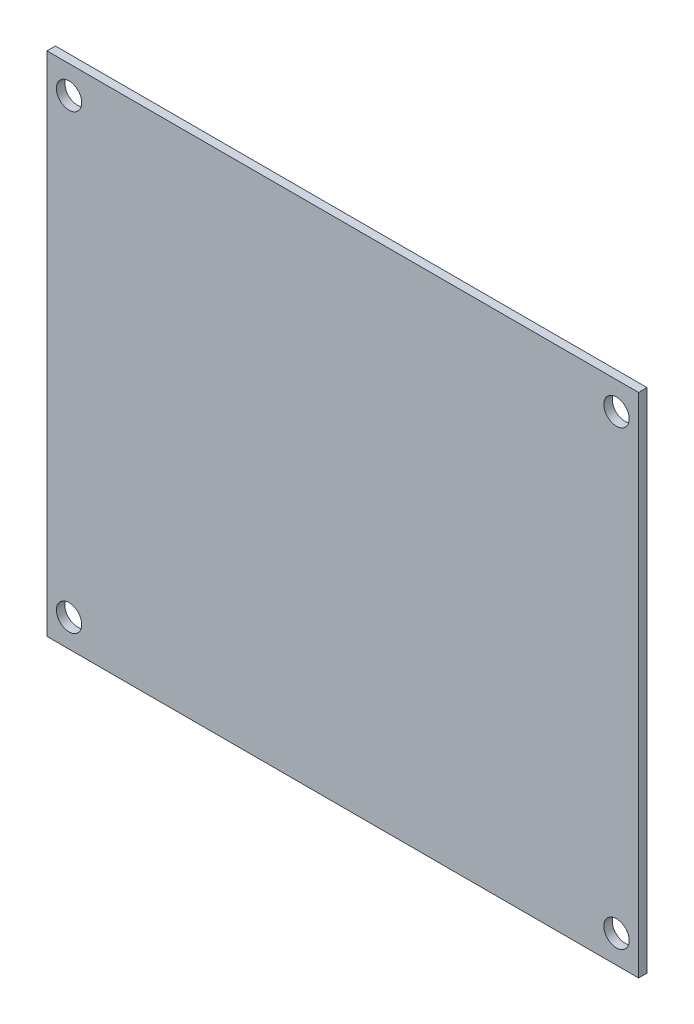
ISO-10303-21;
HEADER;
FILE_DESCRIPTION(('STEP AP214'),'2;1');
FILE_NAME('part.step','',(''),(''),'','','');
FILE_SCHEMA(('AUTOMOTIVE_DESIGN { 1 0 10303 214 1 1 1 1 }'));
ENDSEC;
DATA;
#1=APPLICATION_CONTEXT('core data for automotive mechanical design processes');
#2=APPLICATION_PROTOCOL_DEFINITION('international standard','automotive_design',2000,#1);
#3=PRODUCT_CONTEXT('',#1,'mechanical');
#4=PRODUCT('Part','Part','',(#3));
#5=PRODUCT_RELATED_PRODUCT_CATEGORY('part','',(#4));
#6=PRODUCT_DEFINITION_FORMATION('','',#4);
#7=PRODUCT_DEFINITION_CONTEXT('part definition',#1,'design');
#8=PRODUCT_DEFINITION('design','',#6,#7);
#9=PRODUCT_DEFINITION_SHAPE('','',#8);
#10=(LENGTH_UNIT() NAMED_UNIT(*) SI_UNIT(.MILLI.,.METRE.));
#11=(NAMED_UNIT(*) PLANE_ANGLE_UNIT() SI_UNIT($,.RADIAN.));
#12=(NAMED_UNIT(*) SI_UNIT($,.STERADIAN.) SOLID_ANGLE_UNIT());
#13=UNCERTAINTY_MEASURE_WITH_UNIT(LENGTH_MEASURE(1.E-05),#10,'distance_accuracy_value','');
#14=(GEOMETRIC_REPRESENTATION_CONTEXT(3) GLOBAL_UNCERTAINTY_ASSIGNED_CONTEXT((#13)) GLOBAL_UNIT_ASSIGNED_CONTEXT((#10,
#11,#12)) REPRESENTATION_CONTEXT('',''));
#15=CARTESIAN_POINT('',(0.,0.,0.));
#16=DIRECTION('',(0.,0.,1.));
#17=DIRECTION('',(1.,0.,0.));
#18=AXIS2_PLACEMENT_3D('',#15,#16,#17);
#19=CARTESIAN_POINT('',(0.,0.,1.));
#20=DIRECTION('',(0.,0.,1.));
#21=DIRECTION('',(1.,0.,0.));
#22=AXIS2_PLACEMENT_3D('',#19,#20,#21);
#23=PLANE('',#22);
#24=CARTESIAN_POINT('',(32.385,-26.73,1.));
#25=DIRECTION('',(0.,0.,1.));
#26=DIRECTION('',(1.,0.,0.));
#27=AXIS2_PLACEMENT_3D('',#24,#25,#26);
#28=CIRCLE('',#27,1.5);
#29=CARTESIAN_POINT('',(33.885,-26.73,1.));
#30=VERTEX_POINT('',#29);
#31=EDGE_CURVE('E121',#30,#30,#28,.T.);
#32=ORIENTED_EDGE('',*,*,#31,.F.);
#33=EDGE_LOOP('',(#32));
#34=FACE_BOUND('',#33,.T.);
#35=CARTESIAN_POINT('',(-32.385,26.73,1.));
#36=DIRECTION('',(0.,0.,1.));
#37=DIRECTION('',(1.,0.,0.));
#38=AXIS2_PLACEMENT_3D('',#35,#36,#37);
#39=CIRCLE('',#38,1.5);
#40=CARTESIAN_POINT('',(-30.885,26.73,1.));
#41=VERTEX_POINT('',#40);
#42=EDGE_CURVE('E100',#41,#41,#39,.T.);
#43=ORIENTED_EDGE('',*,*,#42,.F.);
#44=EDGE_LOOP('',(#43));
#45=FACE_BOUND('',#44,.T.);
#46=DIRECTION('',(0.,1.,0.));
#47=VECTOR('',#46,1.);
#48=CARTESIAN_POINT('',(35.,30.,1.));
#49=LINE('',#48,#47);
#50=CARTESIAN_POINT('',(35.,-30.,1.));
#51=VERTEX_POINT('',#50);
#52=CARTESIAN_POINT('',(35.,30.,1.));
#53=VERTEX_POINT('',#52);
#54=EDGE_CURVE('E85',#51,#53,#49,.T.);
#55=ORIENTED_EDGE('',*,*,#54,.T.);
#56=DIRECTION('',(-1.,0.,0.));
#57=VECTOR('',#56,1.);
#58=CARTESIAN_POINT('',(-35.,30.,1.));
#59=LINE('',#58,#57);
#60=CARTESIAN_POINT('',(-35.,30.,1.));
#61=VERTEX_POINT('',#60);
#62=EDGE_CURVE('E80',#53,#61,#59,.T.);
#63=ORIENTED_EDGE('',*,*,#62,.T.);
#64=DIRECTION('',(0.,-1.,0.));
#65=VECTOR('',#64,1.);
#66=CARTESIAN_POINT('',(-35.,30.,1.));
#67=LINE('',#66,#65);
#68=CARTESIAN_POINT('',(-35.,-30.,1.));
#69=VERTEX_POINT('',#68);
#70=EDGE_CURVE('E83',#61,#69,#67,.T.);
#71=ORIENTED_EDGE('',*,*,#70,.T.);
#72=DIRECTION('',(1.,0.,0.));
#73=VECTOR('',#72,1.);
#74=CARTESIAN_POINT('',(-35.,-30.,1.));
#75=LINE('',#74,#73);
#76=EDGE_CURVE('E50',#69,#51,#75,.T.);
#77=ORIENTED_EDGE('',*,*,#76,.T.);
#78=EDGE_LOOP('',(#55,#63,#71,#77));
#79=FACE_BOUND('',#78,.T.);
#80=CARTESIAN_POINT('',(-32.385,-26.73,1.));
#81=DIRECTION('',(0.,0.,1.));
#82=DIRECTION('',(1.,0.,0.));
#83=AXIS2_PLACEMENT_3D('',#80,#81,#82);
#84=CIRCLE('',#83,1.5);
#85=CARTESIAN_POINT('',(-30.885,-26.73,1.));
#86=VERTEX_POINT('',#85);
#87=EDGE_CURVE('E115',#86,#86,#84,.T.);
#88=ORIENTED_EDGE('',*,*,#87,.F.);
#89=EDGE_LOOP('',(#88));
#90=FACE_BOUND('',#89,.T.);
#91=CARTESIAN_POINT('',(32.385,26.73,1.));
#92=DIRECTION('',(0.,0.,1.));
#93=DIRECTION('',(1.,0.,0.));
#94=AXIS2_PLACEMENT_3D('',#91,#92,#93);
#95=CIRCLE('',#94,1.5);
#96=CARTESIAN_POINT('',(33.885,26.73,1.));
#97=VERTEX_POINT('',#96);
#98=EDGE_CURVE('E127',#97,#97,#95,.T.);
#99=ORIENTED_EDGE('',*,*,#98,.F.);
#100=EDGE_LOOP('',(#99));
#101=FACE_BOUND('',#100,.T.);
#102=ADVANCED_FACE('F33',(#34,#45,#79,#90,#101),#23,.T.);
#103=CARTESIAN_POINT('',(0.,0.,0.));
#104=DIRECTION('',(0.,0.,1.));
#105=DIRECTION('',(1.,0.,0.));
#106=AXIS2_PLACEMENT_3D('',#103,#104,#105);
#107=PLANE('',#106);
#108=DIRECTION('',(0.,1.,0.));
#109=VECTOR('',#108,1.);
#110=CARTESIAN_POINT('',(35.,30.,0.));
#111=LINE('',#110,#109);
#112=CARTESIAN_POINT('',(35.,-30.,0.));
#113=VERTEX_POINT('',#112);
#114=CARTESIAN_POINT('',(35.,30.,0.));
#115=VERTEX_POINT('',#114);
#116=EDGE_CURVE('E97',#113,#115,#111,.T.);
#117=ORIENTED_EDGE('',*,*,#116,.F.);
#118=DIRECTION('',(1.,0.,0.));
#119=VECTOR('',#118,1.);
#120=CARTESIAN_POINT('',(-35.,-30.,0.));
#121=LINE('',#120,#119);
#122=CARTESIAN_POINT('',(-35.,-30.,0.));
#123=VERTEX_POINT('',#122);
#124=EDGE_CURVE('E73',#123,#113,#121,.T.);
#125=ORIENTED_EDGE('',*,*,#124,.F.);
#126=DIRECTION('',(0.,-1.,0.));
#127=VECTOR('',#126,1.);
#128=CARTESIAN_POINT('',(-35.,30.,0.));
#129=LINE('',#128,#127);
#130=CARTESIAN_POINT('',(-35.,30.,0.));
#131=VERTEX_POINT('',#130);
#132=EDGE_CURVE('E67',#131,#123,#129,.T.);
#133=ORIENTED_EDGE('',*,*,#132,.F.);
#134=DIRECTION('',(-1.,0.,0.));
#135=VECTOR('',#134,1.);
#136=CARTESIAN_POINT('',(-35.,30.,0.));
#137=LINE('',#136,#135);
#138=EDGE_CURVE('E89',#115,#131,#137,.T.);
#139=ORIENTED_EDGE('',*,*,#138,.F.);
#140=EDGE_LOOP('',(#117,#125,#133,#139));
#141=FACE_BOUND('',#140,.T.);
#142=CARTESIAN_POINT('',(-32.385,26.73,0.));
#143=DIRECTION('',(0.,0.,1.));
#144=DIRECTION('',(1.,0.,0.));
#145=AXIS2_PLACEMENT_3D('',#142,#143,#144);
#146=CIRCLE('',#145,1.5);
#147=CARTESIAN_POINT('',(-30.885,26.73,0.));
#148=VERTEX_POINT('',#147);
#149=EDGE_CURVE('E112',#148,#148,#146,.T.);
#150=ORIENTED_EDGE('',*,*,#149,.T.);
#151=EDGE_LOOP('',(#150));
#152=FACE_BOUND('',#151,.T.);
#153=CARTESIAN_POINT('',(-32.385,-26.73,0.));
#154=DIRECTION('',(0.,0.,1.));
#155=DIRECTION('',(1.,0.,0.));
#156=AXIS2_PLACEMENT_3D('',#153,#154,#155);
#157=CIRCLE('',#156,1.5);
#158=CARTESIAN_POINT('',(-30.885,-26.73,0.));
#159=VERTEX_POINT('',#158);
#160=EDGE_CURVE('E118',#159,#159,#157,.T.);
#161=ORIENTED_EDGE('',*,*,#160,.T.);
#162=EDGE_LOOP('',(#161));
#163=FACE_BOUND('',#162,.T.);
#164=CARTESIAN_POINT('',(32.385,-26.73,0.));
#165=DIRECTION('',(0.,0.,1.));
#166=DIRECTION('',(1.,0.,0.));
#167=AXIS2_PLACEMENT_3D('',#164,#165,#166);
#168=CIRCLE('',#167,1.5);
#169=CARTESIAN_POINT('',(33.885,-26.73,0.));
#170=VERTEX_POINT('',#169);
#171=EDGE_CURVE('E124',#170,#170,#168,.T.);
#172=ORIENTED_EDGE('',*,*,#171,.T.);
#173=EDGE_LOOP('',(#172));
#174=FACE_BOUND('',#173,.T.);
#175=CARTESIAN_POINT('',(32.385,26.73,0.));
#176=DIRECTION('',(0.,0.,1.));
#177=DIRECTION('',(1.,0.,0.));
#178=AXIS2_PLACEMENT_3D('',#175,#176,#177);
#179=CIRCLE('',#178,1.5);
#180=CARTESIAN_POINT('',(33.885,26.73,0.));
#181=VERTEX_POINT('',#180);
#182=EDGE_CURVE('E130',#181,#181,#179,.T.);
#183=ORIENTED_EDGE('',*,*,#182,.T.);
#184=EDGE_LOOP('',(#183));
#185=FACE_BOUND('',#184,.T.);
#186=ADVANCED_FACE('F108',(#141,#152,#163,#174,#185),#107,.F.);
#187=CARTESIAN_POINT('',(35.,30.,1.));
#188=DIRECTION('',(-1.,0.,0.));
#189=DIRECTION('',(0.,0.,1.));
#190=AXIS2_PLACEMENT_3D('',#187,#188,#189);
#191=PLANE('',#190);
#192=ORIENTED_EDGE('',*,*,#116,.T.);
#193=DIRECTION('',(0.,0.,-1.));
#194=VECTOR('',#193,1.);
#195=CARTESIAN_POINT('',(35.,30.,1.));
#196=LINE('',#195,#194);
#197=EDGE_CURVE('E11',#53,#115,#196,.T.);
#198=ORIENTED_EDGE('',*,*,#197,.F.);
#199=ORIENTED_EDGE('',*,*,#54,.F.);
#200=DIRECTION('',(0.,0.,-1.));
#201=VECTOR('',#200,1.);
#202=CARTESIAN_POINT('',(35.,-30.,1.));
#203=LINE('',#202,#201);
#204=EDGE_CURVE('E93',#51,#113,#203,.T.);
#205=ORIENTED_EDGE('',*,*,#204,.T.);
#206=EDGE_LOOP('',(#192,#198,#199,#205));
#207=FACE_BOUND('',#206,.T.);
#208=ADVANCED_FACE('F35',(#207),#191,.F.);
#209=CARTESIAN_POINT('',(-35.,30.,1.));
#210=DIRECTION('',(0.,-1.,0.));
#211=DIRECTION('',(0.,0.,-1.));
#212=AXIS2_PLACEMENT_3D('',#209,#210,#211);
#213=PLANE('',#212);
#214=ORIENTED_EDGE('',*,*,#138,.T.);
#215=DIRECTION('',(0.,0.,-1.));
#216=VECTOR('',#215,1.);
#217=CARTESIAN_POINT('',(-35.,30.,1.));
#218=LINE('',#217,#216);
#219=EDGE_CURVE('E42',#61,#131,#218,.T.);
#220=ORIENTED_EDGE('',*,*,#219,.F.);
#221=ORIENTED_EDGE('',*,*,#62,.F.);
#222=ORIENTED_EDGE('',*,*,#197,.T.);
#223=EDGE_LOOP('',(#214,#220,#221,#222));
#224=FACE_BOUND('',#223,.T.);
#225=ADVANCED_FACE('F88',(#224),#213,.F.);
#226=CARTESIAN_POINT('',(-35.,30.,1.));
#227=DIRECTION('',(1.,0.,0.));
#228=DIRECTION('',(0.,1.,0.));
#229=AXIS2_PLACEMENT_3D('',#226,#227,#228);
#230=PLANE('',#229);
#231=ORIENTED_EDGE('',*,*,#132,.T.);
#232=DIRECTION('',(0.,0.,-1.));
#233=VECTOR('',#232,1.);
#234=CARTESIAN_POINT('',(-35.,-30.,1.));
#235=LINE('',#234,#233);
#236=EDGE_CURVE('E90',#69,#123,#235,.T.);
#237=ORIENTED_EDGE('',*,*,#236,.F.);
#238=ORIENTED_EDGE('',*,*,#70,.F.);
#239=ORIENTED_EDGE('',*,*,#219,.T.);
#240=EDGE_LOOP('',(#231,#237,#238,#239));
#241=FACE_BOUND('',#240,.T.);
#242=ADVANCED_FACE('F91',(#241),#230,.F.);
#243=CARTESIAN_POINT('',(-35.,-30.,1.));
#244=DIRECTION('',(0.,1.,0.));
#245=DIRECTION('',(0.,0.,1.));
#246=AXIS2_PLACEMENT_3D('',#243,#244,#245);
#247=PLANE('',#246);
#248=ORIENTED_EDGE('',*,*,#124,.T.);
#249=ORIENTED_EDGE('',*,*,#204,.F.);
#250=ORIENTED_EDGE('',*,*,#76,.F.);
#251=ORIENTED_EDGE('',*,*,#236,.T.);
#252=EDGE_LOOP('',(#248,#249,#250,#251));
#253=FACE_BOUND('',#252,.T.);
#254=ADVANCED_FACE('F105',(#253),#247,.F.);
#255=CARTESIAN_POINT('',(-32.385,26.73,1.));
#256=DIRECTION('',(0.,0.,-1.));
#257=DIRECTION('',(-1.,0.,0.));
#258=AXIS2_PLACEMENT_3D('',#255,#256,#257);
#259=CYLINDRICAL_SURFACE('',#258,1.5);
#260=ORIENTED_EDGE('',*,*,#42,.T.);
#261=EDGE_LOOP('',(#260));
#262=FACE_BOUND('',#261,.T.);
#263=ORIENTED_EDGE('',*,*,#149,.F.);
#264=EDGE_LOOP('',(#263));
#265=FACE_BOUND('',#264,.T.);
#266=ADVANCED_FACE('F149',(#262,#265),#259,.F.);
#267=CARTESIAN_POINT('',(-32.385,-26.73,1.));
#268=DIRECTION('',(0.,0.,-1.));
#269=DIRECTION('',(-1.,0.,0.));
#270=AXIS2_PLACEMENT_3D('',#267,#268,#269);
#271=CYLINDRICAL_SURFACE('',#270,1.5);
#272=ORIENTED_EDGE('',*,*,#87,.T.);
#273=EDGE_LOOP('',(#272));
#274=FACE_BOUND('',#273,.T.);
#275=ORIENTED_EDGE('',*,*,#160,.F.);
#276=EDGE_LOOP('',(#275));
#277=FACE_BOUND('',#276,.T.);
#278=ADVANCED_FACE('F195',(#274,#277),#271,.F.);
#279=CARTESIAN_POINT('',(32.385,-26.73,1.));
#280=DIRECTION('',(0.,0.,-1.));
#281=DIRECTION('',(-1.,0.,0.));
#282=AXIS2_PLACEMENT_3D('',#279,#280,#281);
#283=CYLINDRICAL_SURFACE('',#282,1.5);
#284=ORIENTED_EDGE('',*,*,#31,.T.);
#285=EDGE_LOOP('',(#284));
#286=FACE_BOUND('',#285,.T.);
#287=ORIENTED_EDGE('',*,*,#171,.F.);
#288=EDGE_LOOP('',(#287));
#289=FACE_BOUND('',#288,.T.);
#290=ADVANCED_FACE('F203',(#286,#289),#283,.F.);
#291=CARTESIAN_POINT('',(32.385,26.73,1.));
#292=DIRECTION('',(0.,0.,-1.));
#293=DIRECTION('',(-1.,0.,0.));
#294=AXIS2_PLACEMENT_3D('',#291,#292,#293);
#295=CYLINDRICAL_SURFACE('',#294,1.5);
#296=ORIENTED_EDGE('',*,*,#98,.T.);
#297=EDGE_LOOP('',(#296));
#298=FACE_BOUND('',#297,.T.);
#299=ORIENTED_EDGE('',*,*,#182,.F.);
#300=EDGE_LOOP('',(#299));
#301=FACE_BOUND('',#300,.T.);
#302=ADVANCED_FACE('F136',(#298,#301),#295,.F.);
#303=CLOSED_SHELL('',(#102,#186,#208,#225,#242,#254,#266,#278,#290,#302));
#304=MANIFOLD_SOLID_BREP('B2',#303);
#305=ADVANCED_BREP_SHAPE_REPRESENTATION('',(#18,#304),#14);
#306=SHAPE_DEFINITION_REPRESENTATION(#9,#305);
ENDSEC;
END-ISO-10303-21;
